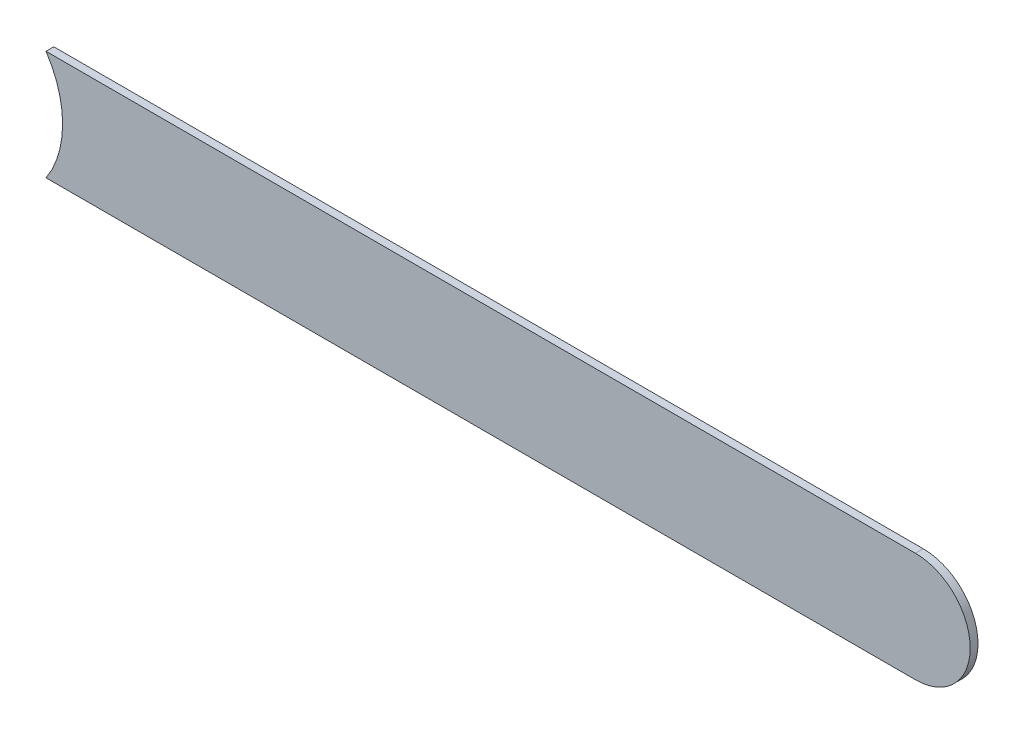
ISO-10303-21;
HEADER;
FILE_DESCRIPTION(('STEP AP214'),'2;1');
FILE_NAME('part.step','',(''),(''),'','','');
FILE_SCHEMA(('AUTOMOTIVE_DESIGN { 1 0 10303 214 1 1 1 1 }'));
ENDSEC;
DATA;
#1=APPLICATION_CONTEXT('core data for automotive mechanical design processes');
#2=APPLICATION_PROTOCOL_DEFINITION('international standard','automotive_design',2000,#1);
#3=PRODUCT_CONTEXT('',#1,'mechanical');
#4=PRODUCT('Part','Part','',(#3));
#5=PRODUCT_RELATED_PRODUCT_CATEGORY('part','',(#4));
#6=PRODUCT_DEFINITION_FORMATION('','',#4);
#7=PRODUCT_DEFINITION_CONTEXT('part definition',#1,'design');
#8=PRODUCT_DEFINITION('design','',#6,#7);
#9=PRODUCT_DEFINITION_SHAPE('','',#8);
#10=(LENGTH_UNIT() NAMED_UNIT(*) SI_UNIT(.MILLI.,.METRE.));
#11=(NAMED_UNIT(*) PLANE_ANGLE_UNIT() SI_UNIT($,.RADIAN.));
#12=(NAMED_UNIT(*) SI_UNIT($,.STERADIAN.) SOLID_ANGLE_UNIT());
#13=UNCERTAINTY_MEASURE_WITH_UNIT(LENGTH_MEASURE(1.E-05),#10,'distance_accuracy_value','');
#14=(GEOMETRIC_REPRESENTATION_CONTEXT(3) GLOBAL_UNCERTAINTY_ASSIGNED_CONTEXT((#13)) GLOBAL_UNIT_ASSIGNED_CONTEXT((#10,
#11,#12)) REPRESENTATION_CONTEXT('',''));
#15=CARTESIAN_POINT('',(0.,0.,0.));
#16=DIRECTION('',(0.,0.,1.));
#17=DIRECTION('',(1.,0.,0.));
#18=AXIS2_PLACEMENT_3D('',#15,#16,#17);
#19=CARTESIAN_POINT('',(51.0251685903459,109.1580113,0.));
#20=DIRECTION('',(0.,1.,0.));
#21=DIRECTION('',(1.,0.,0.));
#22=AXIS2_PLACEMENT_3D('',#19,#20,#21);
#23=PLANE('',#22);
#24=DIRECTION('',(1.,0.,0.));
#25=VECTOR('',#24,1.);
#26=CARTESIAN_POINT('',(50.6510036,109.1580113,0.03556));
#27=LINE('',#26,#25);
#28=CARTESIAN_POINT('',(51.0251685903459,109.1580113,0.03556));
#29=VERTEX_POINT('',#28);
#30=CARTESIAN_POINT('',(54.9919906,109.1580113,0.03556));
#31=VERTEX_POINT('',#30);
#32=EDGE_CURVE('E11',#29,#31,#27,.T.);
#33=ORIENTED_EDGE('',*,*,#32,.F.);
#34=DIRECTION('',(0.,0.,1.));
#35=VECTOR('',#34,1.);
#36=CARTESIAN_POINT('',(51.0251685903459,109.1580113,0.));
#37=LINE('',#36,#35);
#38=CARTESIAN_POINT('',(51.0251685903459,109.1580113,0.));
#39=VERTEX_POINT('',#38);
#40=EDGE_CURVE('E24',#39,#29,#37,.T.);
#41=ORIENTED_EDGE('',*,*,#40,.F.);
#42=DIRECTION('',(1.,0.,0.));
#43=VECTOR('',#42,1.);
#44=CARTESIAN_POINT('',(50.6510036,109.1580113,0.));
#45=LINE('',#44,#43);
#46=CARTESIAN_POINT('',(54.9919906,109.1580113,0.));
#47=VERTEX_POINT('',#46);
#48=EDGE_CURVE('E82',#39,#47,#45,.T.);
#49=ORIENTED_EDGE('',*,*,#48,.T.);
#50=DIRECTION('',(0.,0.,1.));
#51=VECTOR('',#50,1.);
#52=CARTESIAN_POINT('',(54.9919906,109.1580113,0.));
#53=LINE('',#52,#51);
#54=EDGE_CURVE('E37',#47,#31,#53,.T.);
#55=ORIENTED_EDGE('',*,*,#54,.T.);
#56=EDGE_LOOP('',(#33,#41,#49,#55));
#57=FACE_BOUND('',#56,.T.);
#58=ADVANCED_FACE('F17',(#57),#23,.F.);
#59=CARTESIAN_POINT('',(54.9919906,109.4080108,0.));
#60=DIRECTION('',(0.,0.,-1.));
#61=DIRECTION('',(0.,-1.,0.));
#62=AXIS2_PLACEMENT_3D('',#59,#60,#61);
#63=CYLINDRICAL_SURFACE('',#62,0.249999500000001);
#64=CARTESIAN_POINT('',(54.9919906,109.4080108,0.03556));
#65=DIRECTION('',(0.,0.,1.));
#66=DIRECTION('',(0.,-1.,0.));
#67=AXIS2_PLACEMENT_3D('',#64,#65,#66);
#68=CIRCLE('',#67,0.249999500000001);
#69=CARTESIAN_POINT('',(54.9919906,109.6580103,0.03556));
#70=VERTEX_POINT('',#69);
#71=EDGE_CURVE('E97',#31,#70,#68,.T.);
#72=ORIENTED_EDGE('',*,*,#71,.F.);
#73=ORIENTED_EDGE('',*,*,#54,.F.);
#74=CARTESIAN_POINT('',(54.9919906,109.4080108,0.));
#75=DIRECTION('',(0.,0.,1.));
#76=DIRECTION('',(0.,-1.,0.));
#77=AXIS2_PLACEMENT_3D('',#74,#75,#76);
#78=CIRCLE('',#77,0.249999500000001);
#79=CARTESIAN_POINT('',(54.9919906,109.6580103,0.));
#80=VERTEX_POINT('',#79);
#81=EDGE_CURVE('E94',#47,#80,#78,.T.);
#82=ORIENTED_EDGE('',*,*,#81,.T.);
#83=DIRECTION('',(0.,0.,1.));
#84=VECTOR('',#83,1.);
#85=CARTESIAN_POINT('',(54.9919906,109.6580103,0.));
#86=LINE('',#85,#84);
#87=EDGE_CURVE('E92',#80,#70,#86,.T.);
#88=ORIENTED_EDGE('',*,*,#87,.T.);
#89=EDGE_LOOP('',(#72,#73,#82,#88));
#90=FACE_BOUND('',#89,.T.);
#91=ADVANCED_FACE('F103',(#90),#63,.T.);
#92=CARTESIAN_POINT('',(54.9919906,109.6580103,0.));
#93=DIRECTION('',(0.,-1.,0.));
#94=DIRECTION('',(-1.,0.,0.));
#95=AXIS2_PLACEMENT_3D('',#92,#93,#94);
#96=PLANE('',#95);
#97=DIRECTION('',(-1.,0.,0.));
#98=VECTOR('',#97,1.);
#99=CARTESIAN_POINT('',(54.9919906,109.6580103,0.03556));
#100=LINE('',#99,#98);
#101=CARTESIAN_POINT('',(51.0251685903459,109.6580103,0.03556));
#102=VERTEX_POINT('',#101);
#103=EDGE_CURVE('E89',#70,#102,#100,.T.);
#104=ORIENTED_EDGE('',*,*,#103,.F.);
#105=ORIENTED_EDGE('',*,*,#87,.F.);
#106=DIRECTION('',(-1.,0.,0.));
#107=VECTOR('',#106,1.);
#108=CARTESIAN_POINT('',(54.9919906,109.6580103,0.));
#109=LINE('',#108,#107);
#110=CARTESIAN_POINT('',(51.0251685903459,109.6580103,0.));
#111=VERTEX_POINT('',#110);
#112=EDGE_CURVE('E87',#80,#111,#109,.T.);
#113=ORIENTED_EDGE('',*,*,#112,.T.);
#114=DIRECTION('',(0.,0.,1.));
#115=VECTOR('',#114,1.);
#116=CARTESIAN_POINT('',(51.0251685903459,109.6580103,0.));
#117=LINE('',#116,#115);
#118=EDGE_CURVE('E69',#111,#102,#117,.T.);
#119=ORIENTED_EDGE('',*,*,#118,.T.);
#120=EDGE_LOOP('',(#104,#105,#113,#119));
#121=FACE_BOUND('',#120,.T.);
#122=ADVANCED_FACE('F108',(#121),#96,.F.);
#123=CARTESIAN_POINT('',(50.6510036,109.4080108,0.));
#124=DIRECTION('',(0.,0.,-1.));
#125=DIRECTION('',(1.,0.,0.));
#126=AXIS2_PLACEMENT_3D('',#123,#124,#125);
#127=CYLINDRICAL_SURFACE('',#126,0.4499991);
#128=DIRECTION('',(0.,0.,1.));
#129=VECTOR('',#128,1.);
#130=CARTESIAN_POINT('',(51.1010027,109.4080108,0.));
#131=LINE('',#130,#129);
#132=CARTESIAN_POINT('',(51.1010027,109.4080108,0.));
#133=VERTEX_POINT('',#132);
#134=CARTESIAN_POINT('',(51.1010027,109.4080108,0.03556));
#135=VERTEX_POINT('',#134);
#136=EDGE_CURVE('E59',#133,#135,#131,.T.);
#137=ORIENTED_EDGE('',*,*,#136,.T.);
#138=CARTESIAN_POINT('',(50.6510036,109.4080108,0.03556));
#139=DIRECTION('',(0.,0.,1.));
#140=DIRECTION('',(1.,0.,0.));
#141=AXIS2_PLACEMENT_3D('',#138,#139,#140);
#142=CIRCLE('',#141,0.4499991);
#143=EDGE_CURVE('E70',#135,#102,#142,.T.);
#144=ORIENTED_EDGE('',*,*,#143,.T.);
#145=ORIENTED_EDGE('',*,*,#118,.F.);
#146=CARTESIAN_POINT('',(50.6510036,109.4080108,0.));
#147=DIRECTION('',(0.,0.,1.));
#148=DIRECTION('',(1.,0.,0.));
#149=AXIS2_PLACEMENT_3D('',#146,#147,#148);
#150=CIRCLE('',#149,0.4499991);
#151=EDGE_CURVE('E73',#133,#111,#150,.T.);
#152=ORIENTED_EDGE('',*,*,#151,.F.);
#153=EDGE_LOOP('',(#137,#144,#145,#152));
#154=FACE_BOUND('',#153,.T.);
#155=ADVANCED_FACE('F74',(#154),#127,.F.);
#156=CARTESIAN_POINT('',(50.6510036,109.4080108,0.));
#157=DIRECTION('',(0.,0.,-1.));
#158=DIRECTION('',(1.,0.,0.));
#159=AXIS2_PLACEMENT_3D('',#156,#157,#158);
#160=CYLINDRICAL_SURFACE('',#159,0.4499991);
#161=ORIENTED_EDGE('',*,*,#40,.T.);
#162=CARTESIAN_POINT('',(50.6510036,109.4080108,0.03556));
#163=DIRECTION('',(0.,0.,1.));
#164=DIRECTION('',(1.,0.,0.));
#165=AXIS2_PLACEMENT_3D('',#162,#163,#164);
#166=CIRCLE('',#165,0.4499991);
#167=EDGE_CURVE('E65',#29,#135,#166,.T.);
#168=ORIENTED_EDGE('',*,*,#167,.T.);
#169=ORIENTED_EDGE('',*,*,#136,.F.);
#170=EDGE_CURVE('E63',#39,#133,#150,.T.);
#171=ORIENTED_EDGE('',*,*,#170,.F.);
#172=EDGE_LOOP('',(#161,#168,#169,#171));
#173=FACE_BOUND('',#172,.T.);
#174=ADVANCED_FACE('F61',(#173),#160,.F.);
#175=CARTESIAN_POINT('',(50.6510036,109.1580113,0.));
#176=DIRECTION('',(0.,0.,-1.));
#177=DIRECTION('',(-1.,0.,0.));
#178=AXIS2_PLACEMENT_3D('',#175,#176,#177);
#179=PLANE('',#178);
#180=ORIENTED_EDGE('',*,*,#48,.F.);
#181=ORIENTED_EDGE('',*,*,#170,.T.);
#182=ORIENTED_EDGE('',*,*,#151,.T.);
#183=ORIENTED_EDGE('',*,*,#112,.F.);
#184=ORIENTED_EDGE('',*,*,#81,.F.);
#185=EDGE_LOOP('',(#180,#181,#182,#183,#184));
#186=FACE_BOUND('',#185,.T.);
#187=ADVANCED_FACE('F80',(#186),#179,.T.);
#188=CARTESIAN_POINT('',(50.6510036,109.1580113,0.03556));
#189=DIRECTION('',(0.,0.,-1.));
#190=DIRECTION('',(-1.,0.,0.));
#191=AXIS2_PLACEMENT_3D('',#188,#189,#190);
#192=PLANE('',#191);
#193=ORIENTED_EDGE('',*,*,#167,.F.);
#194=ORIENTED_EDGE('',*,*,#32,.T.);
#195=ORIENTED_EDGE('',*,*,#71,.T.);
#196=ORIENTED_EDGE('',*,*,#103,.T.);
#197=ORIENTED_EDGE('',*,*,#143,.F.);
#198=EDGE_LOOP('',(#193,#194,#195,#196,#197));
#199=FACE_BOUND('',#198,.T.);
#200=ADVANCED_FACE('F106',(#199),#192,.F.);
#201=CLOSED_SHELL('',(#58,#91,#122,#155,#174,#187,#200));
#202=MANIFOLD_SOLID_BREP('B1',#201);
#203=ADVANCED_BREP_SHAPE_REPRESENTATION('',(#18,#202),#14);
#204=SHAPE_DEFINITION_REPRESENTATION(#9,#203);
ENDSEC;
END-ISO-10303-21;
